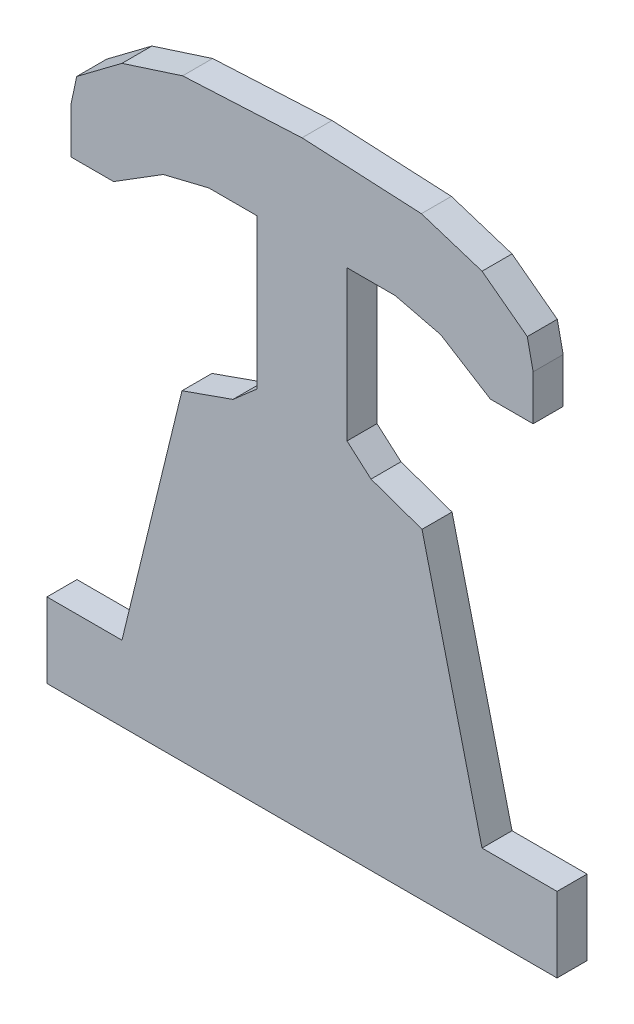
ISO-10303-21;
HEADER;
FILE_DESCRIPTION(('STEP AP214'),'2;1');
FILE_NAME('part.step','',(''),(''),'','','');
FILE_SCHEMA(('AUTOMOTIVE_DESIGN { 1 0 10303 214 1 1 1 1 }'));
ENDSEC;
DATA;
#1=APPLICATION_CONTEXT('core data for automotive mechanical design processes');
#2=APPLICATION_PROTOCOL_DEFINITION('international standard','automotive_design',2000,#1);
#3=PRODUCT_CONTEXT('',#1,'mechanical');
#4=PRODUCT('Part','Part','',(#3));
#5=PRODUCT_RELATED_PRODUCT_CATEGORY('part','',(#4));
#6=PRODUCT_DEFINITION_FORMATION('','',#4);
#7=PRODUCT_DEFINITION_CONTEXT('part definition',#1,'design');
#8=PRODUCT_DEFINITION('design','',#6,#7);
#9=PRODUCT_DEFINITION_SHAPE('','',#8);
#10=(LENGTH_UNIT() NAMED_UNIT(*) SI_UNIT(.MILLI.,.METRE.));
#11=(NAMED_UNIT(*) PLANE_ANGLE_UNIT() SI_UNIT($,.RADIAN.));
#12=(NAMED_UNIT(*) SI_UNIT($,.STERADIAN.) SOLID_ANGLE_UNIT());
#13=UNCERTAINTY_MEASURE_WITH_UNIT(LENGTH_MEASURE(1.E-05),#10,'distance_accuracy_value','');
#14=(GEOMETRIC_REPRESENTATION_CONTEXT(3) GLOBAL_UNCERTAINTY_ASSIGNED_CONTEXT((#13)) GLOBAL_UNIT_ASSIGNED_CONTEXT((#10,
#11,#12)) REPRESENTATION_CONTEXT('',''));
#15=CARTESIAN_POINT('',(0.,0.,0.));
#16=DIRECTION('',(0.,0.,1.));
#17=DIRECTION('',(1.,0.,0.));
#18=AXIS2_PLACEMENT_3D('',#15,#16,#17);
#19=CARTESIAN_POINT('',(0.,200.,10.));
#20=DIRECTION('',(0.0502041750301428,-0.998738975313141,0.));
#21=DIRECTION('',(0.998738975313141,0.0502041750301428,0.));
#22=AXIS2_PLACEMENT_3D('',#19,#20,#21);
#23=PLANE('',#22);
#24=DIRECTION('',(-0.998738975313141,-0.0502041750301428,0.));
#25=VECTOR('',#24,1.);
#26=CARTESIAN_POINT('',(0.,200.,0.));
#27=LINE('',#26,#25);
#28=CARTESIAN_POINT('',(0.,200.,0.));
#29=VERTEX_POINT('',#28);
#30=CARTESIAN_POINT('',(-39.7870884130053,198.,0.));
#31=VERTEX_POINT('',#30);
#32=EDGE_CURVE('E282',#29,#31,#27,.T.);
#33=ORIENTED_EDGE('',*,*,#32,.T.);
#34=DIRECTION('',(0.,0.,-1.));
#35=VECTOR('',#34,1.);
#36=CARTESIAN_POINT('',(-39.7870884130053,198.,10.));
#37=LINE('',#36,#35);
#38=CARTESIAN_POINT('',(-39.7870884130053,198.,10.));
#39=VERTEX_POINT('',#38);
#40=EDGE_CURVE('E11',#39,#31,#37,.T.);
#41=ORIENTED_EDGE('',*,*,#40,.F.);
#42=DIRECTION('',(-0.998738975313141,-0.0502041750301428,0.));
#43=VECTOR('',#42,1.);
#44=CARTESIAN_POINT('',(0.,200.,10.));
#45=LINE('',#44,#43);
#46=CARTESIAN_POINT('',(0.,200.,10.));
#47=VERTEX_POINT('',#46);
#48=EDGE_CURVE('E373',#47,#39,#45,.T.);
#49=ORIENTED_EDGE('',*,*,#48,.F.);
#50=DIRECTION('',(0.,0.,-1.));
#51=VECTOR('',#50,1.);
#52=CARTESIAN_POINT('',(0.,200.,10.));
#53=LINE('',#52,#51);
#54=EDGE_CURVE('E278',#47,#29,#53,.T.);
#55=ORIENTED_EDGE('',*,*,#54,.T.);
#56=EDGE_LOOP('',(#33,#41,#49,#55));
#57=FACE_BOUND('',#56,.T.);
#58=ADVANCED_FACE('F43',(#57),#23,.F.);
#59=CARTESIAN_POINT('',(-39.7870884130053,198.,10.));
#60=DIRECTION('',(0.306136929188108,-0.951987489722042,0.));
#61=DIRECTION('',(0.951987489722042,0.306136929188108,0.));
#62=AXIS2_PLACEMENT_3D('',#59,#60,#61);
#63=PLANE('',#62);
#64=DIRECTION('',(-0.951987489722042,-0.306136929188108,0.));
#65=VECTOR('',#64,1.);
#66=CARTESIAN_POINT('',(-39.7870884130053,198.,0.));
#67=LINE('',#66,#65);
#68=CARTESIAN_POINT('',(-60.,191.5,0.));
#69=VERTEX_POINT('',#68);
#70=EDGE_CURVE('E286',#31,#69,#67,.T.);
#71=ORIENTED_EDGE('',*,*,#70,.T.);
#72=DIRECTION('',(0.,0.,-1.));
#73=VECTOR('',#72,1.);
#74=CARTESIAN_POINT('',(-60.,191.5,10.));
#75=LINE('',#74,#73);
#76=CARTESIAN_POINT('',(-60.,191.5,10.));
#77=VERTEX_POINT('',#76);
#78=EDGE_CURVE('E52',#77,#69,#75,.T.);
#79=ORIENTED_EDGE('',*,*,#78,.F.);
#80=DIRECTION('',(-0.951987489722042,-0.306136929188108,0.));
#81=VECTOR('',#80,1.);
#82=CARTESIAN_POINT('',(-39.7870884130053,198.,10.));
#83=LINE('',#82,#81);
#84=EDGE_CURVE('E172',#39,#77,#83,.T.);
#85=ORIENTED_EDGE('',*,*,#84,.F.);
#86=ORIENTED_EDGE('',*,*,#40,.T.);
#87=EDGE_LOOP('',(#71,#79,#85,#86));
#88=FACE_BOUND('',#87,.T.);
#89=ADVANCED_FACE('F600',(#88),#63,.F.);
#90=CARTESIAN_POINT('',(-60.,191.5,10.));
#91=DIRECTION('',(0.600493198028697,-0.7996298638253,0.));
#92=DIRECTION('',(0.7996298638253,0.600493198028697,0.));
#93=AXIS2_PLACEMENT_3D('',#90,#91,#92);
#94=PLANE('',#93);
#95=DIRECTION('',(-0.7996298638253,-0.600493198028697,0.));
#96=VECTOR('',#95,1.);
#97=CARTESIAN_POINT('',(-60.,191.5,0.));
#98=LINE('',#97,#96);
#99=CARTESIAN_POINT('',(-75.0854249963274,180.171389714822,0.));
#100=VERTEX_POINT('',#99);
#101=EDGE_CURVE('E289',#69,#100,#98,.T.);
#102=ORIENTED_EDGE('',*,*,#101,.T.);
#103=DIRECTION('',(0.,0.,-1.));
#104=VECTOR('',#103,1.);
#105=CARTESIAN_POINT('',(-75.0854249963274,180.171389714822,10.));
#106=LINE('',#105,#104);
#107=CARTESIAN_POINT('',(-75.0854249963274,180.171389714822,10.));
#108=VERTEX_POINT('',#107);
#109=EDGE_CURVE('E476',#108,#100,#106,.T.);
#110=ORIENTED_EDGE('',*,*,#109,.F.);
#111=DIRECTION('',(-0.7996298638253,-0.600493198028697,0.));
#112=VECTOR('',#111,1.);
#113=CARTESIAN_POINT('',(-60.,191.5,10.));
#114=LINE('',#113,#112);
#115=EDGE_CURVE('E486',#77,#108,#114,.T.);
#116=ORIENTED_EDGE('',*,*,#115,.F.);
#117=ORIENTED_EDGE('',*,*,#78,.T.);
#118=EDGE_LOOP('',(#102,#110,#116,#117));
#119=FACE_BOUND('',#118,.T.);
#120=ADVANCED_FACE('F484',(#119),#94,.F.);
#121=CARTESIAN_POINT('',(-75.0854249963274,180.171389714822,10.));
#122=DIRECTION('',(0.978301757242913,-0.20718511475352,0.));
#123=DIRECTION('',(0.20718511475352,0.978301757242913,0.));
#124=AXIS2_PLACEMENT_3D('',#121,#122,#123);
#125=PLANE('',#124);
#126=DIRECTION('',(-0.20718511475352,-0.978301757242913,0.));
#127=VECTOR('',#126,1.);
#128=CARTESIAN_POINT('',(-75.0854249963274,180.171389714822,0.));
#129=LINE('',#128,#127);
#130=CARTESIAN_POINT('',(-77.0338044627042,170.971389714822,0.));
#131=VERTEX_POINT('',#130);
#132=EDGE_CURVE('E292',#100,#131,#129,.T.);
#133=ORIENTED_EDGE('',*,*,#132,.T.);
#134=DIRECTION('',(0.,0.,-1.));
#135=VECTOR('',#134,1.);
#136=CARTESIAN_POINT('',(-77.0338044627042,170.971389714822,10.));
#137=LINE('',#136,#135);
#138=CARTESIAN_POINT('',(-77.0338044627042,170.971389714822,10.));
#139=VERTEX_POINT('',#138);
#140=EDGE_CURVE('E472',#139,#131,#137,.T.);
#141=ORIENTED_EDGE('',*,*,#140,.F.);
#142=DIRECTION('',(-0.20718511475352,-0.978301757242913,0.));
#143=VECTOR('',#142,1.);
#144=CARTESIAN_POINT('',(-75.0854249963274,180.171389714822,10.));
#145=LINE('',#144,#143);
#146=EDGE_CURVE('E505',#108,#139,#145,.T.);
#147=ORIENTED_EDGE('',*,*,#146,.F.);
#148=ORIENTED_EDGE('',*,*,#109,.T.);
#149=EDGE_LOOP('',(#133,#141,#147,#148));
#150=FACE_BOUND('',#149,.T.);
#151=ADVANCED_FACE('F495',(#150),#125,.F.);
#152=CARTESIAN_POINT('',(-77.0338044627042,170.971389714822,10.));
#153=DIRECTION('',(1.,0.,0.));
#154=DIRECTION('',(0.,0.,-1.));
#155=AXIS2_PLACEMENT_3D('',#152,#153,#154);
#156=PLANE('',#155);
#157=DIRECTION('',(0.,-1.,0.));
#158=VECTOR('',#157,1.);
#159=CARTESIAN_POINT('',(-77.0338044627042,170.971389714822,0.));
#160=LINE('',#159,#158);
#161=CARTESIAN_POINT('',(-77.0338044627042,155.971389714822,0.));
#162=VERTEX_POINT('',#161);
#163=EDGE_CURVE('E295',#131,#162,#160,.T.);
#164=ORIENTED_EDGE('',*,*,#163,.T.);
#165=DIRECTION('',(0.,0.,-1.));
#166=VECTOR('',#165,1.);
#167=CARTESIAN_POINT('',(-77.0338044627042,155.971389714822,10.));
#168=LINE('',#167,#166);
#169=CARTESIAN_POINT('',(-77.0338044627042,155.971389714822,10.));
#170=VERTEX_POINT('',#169);
#171=EDGE_CURVE('E468',#170,#162,#168,.T.);
#172=ORIENTED_EDGE('',*,*,#171,.F.);
#173=DIRECTION('',(0.,-1.,0.));
#174=VECTOR('',#173,1.);
#175=CARTESIAN_POINT('',(-77.0338044627042,170.971389714822,10.));
#176=LINE('',#175,#174);
#177=EDGE_CURVE('E501',#139,#170,#176,.T.);
#178=ORIENTED_EDGE('',*,*,#177,.F.);
#179=ORIENTED_EDGE('',*,*,#140,.T.);
#180=EDGE_LOOP('',(#164,#172,#178,#179));
#181=FACE_BOUND('',#180,.T.);
#182=ADVANCED_FACE('F499',(#181),#156,.F.);
#183=CARTESIAN_POINT('',(-77.0338044627042,155.971389714822,10.));
#184=DIRECTION('',(0.,1.,0.));
#185=DIRECTION('',(0.,0.,1.));
#186=AXIS2_PLACEMENT_3D('',#183,#184,#185);
#187=PLANE('',#186);
#188=DIRECTION('',(1.,0.,0.));
#189=VECTOR('',#188,1.);
#190=CARTESIAN_POINT('',(-77.0338044627042,155.971389714822,0.));
#191=LINE('',#190,#189);
#192=CARTESIAN_POINT('',(-62.7938486432291,155.971389714822,0.));
#193=VERTEX_POINT('',#192);
#194=EDGE_CURVE('E298',#162,#193,#191,.T.);
#195=ORIENTED_EDGE('',*,*,#194,.T.);
#196=DIRECTION('',(0.,0.,-1.));
#197=VECTOR('',#196,1.);
#198=CARTESIAN_POINT('',(-62.7938486432291,155.971389714822,10.));
#199=LINE('',#198,#197);
#200=CARTESIAN_POINT('',(-62.7938486432291,155.971389714822,10.));
#201=VERTEX_POINT('',#200);
#202=EDGE_CURVE('E464',#201,#193,#199,.T.);
#203=ORIENTED_EDGE('',*,*,#202,.F.);
#204=DIRECTION('',(1.,0.,0.));
#205=VECTOR('',#204,1.);
#206=CARTESIAN_POINT('',(-77.0338044627042,155.971389714822,10.));
#207=LINE('',#206,#205);
#208=EDGE_CURVE('E504',#170,#201,#207,.T.);
#209=ORIENTED_EDGE('',*,*,#208,.F.);
#210=ORIENTED_EDGE('',*,*,#171,.T.);
#211=EDGE_LOOP('',(#195,#203,#209,#210));
#212=FACE_BOUND('',#211,.T.);
#213=ADVANCED_FACE('F613',(#212),#187,.F.);
#214=CARTESIAN_POINT('',(-46.2252698691955,166.291261255929,10.));
#215=DIRECTION('',(-0.528690857811553,0.848814453733255,0.));
#216=DIRECTION('',(-0.848814453733255,-0.528690857811553,0.));
#217=AXIS2_PLACEMENT_3D('',#214,#215,#216);
#218=PLANE('',#217);
#219=DIRECTION('',(0.848814453733255,0.528690857811553,0.));
#220=VECTOR('',#219,1.);
#221=CARTESIAN_POINT('',(-46.2252698691955,166.291261255929,0.));
#222=LINE('',#221,#220);
#223=CARTESIAN_POINT('',(-46.2252698691955,166.291261255929,0.));
#224=VERTEX_POINT('',#223);
#225=EDGE_CURVE('E301',#193,#224,#222,.T.);
#226=ORIENTED_EDGE('',*,*,#225,.T.);
#227=DIRECTION('',(0.,0.,-1.));
#228=VECTOR('',#227,1.);
#229=CARTESIAN_POINT('',(-46.2252698691955,166.291261255929,10.));
#230=LINE('',#229,#228);
#231=CARTESIAN_POINT('',(-46.2252698691955,166.291261255929,10.));
#232=VERTEX_POINT('',#231);
#233=EDGE_CURVE('E460',#232,#224,#230,.T.);
#234=ORIENTED_EDGE('',*,*,#233,.F.);
#235=DIRECTION('',(0.848814453733255,0.528690857811553,0.));
#236=VECTOR('',#235,1.);
#237=CARTESIAN_POINT('',(-46.2252698691955,166.291261255929,10.));
#238=LINE('',#237,#236);
#239=EDGE_CURVE('E509',#201,#232,#238,.T.);
#240=ORIENTED_EDGE('',*,*,#239,.F.);
#241=ORIENTED_EDGE('',*,*,#202,.T.);
#242=EDGE_LOOP('',(#226,#234,#240,#241));
#243=FACE_BOUND('',#242,.T.);
#244=ADVANCED_FACE('F616',(#243),#218,.F.);
#245=CARTESIAN_POINT('',(-31.0557683465319,170.,10.));
#246=DIRECTION('',(-0.237491663978951,0.971389576606888,0.));
#247=DIRECTION('',(-0.971389576606888,-0.237491663978951,0.));
#248=AXIS2_PLACEMENT_3D('',#245,#246,#247);
#249=PLANE('',#248);
#250=DIRECTION('',(0.971389576606888,0.237491663978951,0.));
#251=VECTOR('',#250,1.);
#252=CARTESIAN_POINT('',(-31.0557683465319,170.,0.));
#253=LINE('',#252,#251);
#254=CARTESIAN_POINT('',(-31.0557683465319,170.,0.));
#255=VERTEX_POINT('',#254);
#256=EDGE_CURVE('E304',#224,#255,#253,.T.);
#257=ORIENTED_EDGE('',*,*,#256,.T.);
#258=DIRECTION('',(0.,0.,-1.));
#259=VECTOR('',#258,1.);
#260=CARTESIAN_POINT('',(-31.0557683465319,170.,10.));
#261=LINE('',#260,#259);
#262=CARTESIAN_POINT('',(-31.0557683465319,170.,10.));
#263=VERTEX_POINT('',#262);
#264=EDGE_CURVE('E456',#263,#255,#261,.T.);
#265=ORIENTED_EDGE('',*,*,#264,.F.);
#266=DIRECTION('',(0.971389576606888,0.237491663978951,0.));
#267=VECTOR('',#266,1.);
#268=CARTESIAN_POINT('',(-31.0557683465319,170.,10.));
#269=LINE('',#268,#267);
#270=EDGE_CURVE('E516',#232,#263,#269,.T.);
#271=ORIENTED_EDGE('',*,*,#270,.F.);
#272=ORIENTED_EDGE('',*,*,#233,.T.);
#273=EDGE_LOOP('',(#257,#265,#271,#272));
#274=FACE_BOUND('',#273,.T.);
#275=ADVANCED_FACE('F620',(#274),#249,.F.);
#276=CARTESIAN_POINT('',(-15.,170.,10.));
#277=DIRECTION('',(0.,1.,0.));
#278=DIRECTION('',(0.,0.,1.));
#279=AXIS2_PLACEMENT_3D('',#276,#277,#278);
#280=PLANE('',#279);
#281=DIRECTION('',(1.,0.,0.));
#282=VECTOR('',#281,1.);
#283=CARTESIAN_POINT('',(-15.,170.,0.));
#284=LINE('',#283,#282);
#285=CARTESIAN_POINT('',(-15.,170.,0.));
#286=VERTEX_POINT('',#285);
#287=EDGE_CURVE('E307',#255,#286,#284,.T.);
#288=ORIENTED_EDGE('',*,*,#287,.T.);
#289=DIRECTION('',(0.,0.,-1.));
#290=VECTOR('',#289,1.);
#291=CARTESIAN_POINT('',(-15.,170.,10.));
#292=LINE('',#291,#290);
#293=CARTESIAN_POINT('',(-15.,170.,10.));
#294=VERTEX_POINT('',#293);
#295=EDGE_CURVE('E452',#294,#286,#292,.T.);
#296=ORIENTED_EDGE('',*,*,#295,.F.);
#297=DIRECTION('',(1.,0.,0.));
#298=VECTOR('',#297,1.);
#299=CARTESIAN_POINT('',(-15.,170.,10.));
#300=LINE('',#299,#298);
#301=EDGE_CURVE('E519',#263,#294,#300,.T.);
#302=ORIENTED_EDGE('',*,*,#301,.F.);
#303=ORIENTED_EDGE('',*,*,#264,.T.);
#304=EDGE_LOOP('',(#288,#296,#302,#303));
#305=FACE_BOUND('',#304,.T.);
#306=ADVANCED_FACE('F624',(#305),#280,.F.);
#307=CARTESIAN_POINT('',(-15.,120.,10.));
#308=DIRECTION('',(1.,0.,0.));
#309=DIRECTION('',(0.,1.,0.));
#310=AXIS2_PLACEMENT_3D('',#307,#308,#309);
#311=PLANE('',#310);
#312=DIRECTION('',(0.,-1.,0.));
#313=VECTOR('',#312,1.);
#314=CARTESIAN_POINT('',(-15.,120.,0.));
#315=LINE('',#314,#313);
#316=CARTESIAN_POINT('',(-15.,120.,0.));
#317=VERTEX_POINT('',#316);
#318=EDGE_CURVE('E310',#286,#317,#315,.T.);
#319=ORIENTED_EDGE('',*,*,#318,.T.);
#320=DIRECTION('',(0.,0.,-1.));
#321=VECTOR('',#320,1.);
#322=CARTESIAN_POINT('',(-15.,120.,10.));
#323=LINE('',#322,#321);
#324=CARTESIAN_POINT('',(-15.,120.,10.));
#325=VERTEX_POINT('',#324);
#326=EDGE_CURVE('E448',#325,#317,#323,.T.);
#327=ORIENTED_EDGE('',*,*,#326,.F.);
#328=DIRECTION('',(0.,-1.,0.));
#329=VECTOR('',#328,1.);
#330=CARTESIAN_POINT('',(-15.,120.,10.));
#331=LINE('',#330,#329);
#332=EDGE_CURVE('E522',#294,#325,#331,.T.);
#333=ORIENTED_EDGE('',*,*,#332,.F.);
#334=ORIENTED_EDGE('',*,*,#295,.T.);
#335=EDGE_LOOP('',(#319,#327,#333,#334));
#336=FACE_BOUND('',#335,.T.);
#337=ADVANCED_FACE('F628',(#336),#311,.F.);
#338=CARTESIAN_POINT('',(-23.,113.,10.));
#339=DIRECTION('',(0.658504607868519,-0.752576694706877,0.));
#340=DIRECTION('',(0.752576694706877,0.658504607868519,0.));
#341=AXIS2_PLACEMENT_3D('',#338,#339,#340);
#342=PLANE('',#341);
#343=DIRECTION('',(-0.752576694706877,-0.658504607868519,0.));
#344=VECTOR('',#343,1.);
#345=CARTESIAN_POINT('',(-23.,113.,0.));
#346=LINE('',#345,#344);
#347=CARTESIAN_POINT('',(-23.,113.,0.));
#348=VERTEX_POINT('',#347);
#349=EDGE_CURVE('E313',#317,#348,#346,.T.);
#350=ORIENTED_EDGE('',*,*,#349,.T.);
#351=DIRECTION('',(0.,0.,-1.));
#352=VECTOR('',#351,1.);
#353=CARTESIAN_POINT('',(-23.,113.,10.));
#354=LINE('',#353,#352);
#355=CARTESIAN_POINT('',(-23.,113.,10.));
#356=VERTEX_POINT('',#355);
#357=EDGE_CURVE('E444',#356,#348,#354,.T.);
#358=ORIENTED_EDGE('',*,*,#357,.F.);
#359=DIRECTION('',(-0.752576694706877,-0.658504607868519,0.));
#360=VECTOR('',#359,1.);
#361=CARTESIAN_POINT('',(-23.,113.,10.));
#362=LINE('',#361,#360);
#363=EDGE_CURVE('E525',#325,#356,#362,.T.);
#364=ORIENTED_EDGE('',*,*,#363,.F.);
#365=ORIENTED_EDGE('',*,*,#326,.T.);
#366=EDGE_LOOP('',(#350,#358,#364,#365));
#367=FACE_BOUND('',#366,.T.);
#368=ADVANCED_FACE('F632',(#367),#342,.F.);
#369=CARTESIAN_POINT('',(-40.,107.,10.));
#370=DIRECTION('',(0.332820117735137,-0.94299033358289,0.));
#371=DIRECTION('',(0.94299033358289,0.332820117735137,0.));
#372=AXIS2_PLACEMENT_3D('',#369,#370,#371);
#373=PLANE('',#372);
#374=DIRECTION('',(-0.94299033358289,-0.332820117735137,0.));
#375=VECTOR('',#374,1.);
#376=CARTESIAN_POINT('',(-40.,107.,0.));
#377=LINE('',#376,#375);
#378=CARTESIAN_POINT('',(-40.,107.,0.));
#379=VERTEX_POINT('',#378);
#380=EDGE_CURVE('E316',#348,#379,#377,.T.);
#381=ORIENTED_EDGE('',*,*,#380,.T.);
#382=DIRECTION('',(0.,0.,-1.));
#383=VECTOR('',#382,1.);
#384=CARTESIAN_POINT('',(-40.,107.,10.));
#385=LINE('',#384,#383);
#386=CARTESIAN_POINT('',(-40.,107.,10.));
#387=VERTEX_POINT('',#386);
#388=EDGE_CURVE('E440',#387,#379,#385,.T.);
#389=ORIENTED_EDGE('',*,*,#388,.F.);
#390=DIRECTION('',(-0.94299033358289,-0.332820117735137,0.));
#391=VECTOR('',#390,1.);
#392=CARTESIAN_POINT('',(-40.,107.,10.));
#393=LINE('',#392,#391);
#394=EDGE_CURVE('E528',#356,#387,#393,.T.);
#395=ORIENTED_EDGE('',*,*,#394,.F.);
#396=ORIENTED_EDGE('',*,*,#357,.T.);
#397=EDGE_LOOP('',(#381,#389,#395,#396));
#398=FACE_BOUND('',#397,.T.);
#399=ADVANCED_FACE('F636',(#398),#373,.F.);
#400=CARTESIAN_POINT('',(-60.,25.,10.));
#401=DIRECTION('',(0.97152033878313,-0.236956180191007,0.));
#402=DIRECTION('',(0.236956180191007,0.97152033878313,0.));
#403=AXIS2_PLACEMENT_3D('',#400,#401,#402);
#404=PLANE('',#403);
#405=DIRECTION('',(-0.236956180191007,-0.97152033878313,0.));
#406=VECTOR('',#405,1.);
#407=CARTESIAN_POINT('',(-60.,25.,0.));
#408=LINE('',#407,#406);
#409=CARTESIAN_POINT('',(-60.,25.,0.));
#410=VERTEX_POINT('',#409);
#411=EDGE_CURVE('E319',#379,#410,#408,.T.);
#412=ORIENTED_EDGE('',*,*,#411,.T.);
#413=DIRECTION('',(0.,0.,-1.));
#414=VECTOR('',#413,1.);
#415=CARTESIAN_POINT('',(-60.,25.,10.));
#416=LINE('',#415,#414);
#417=CARTESIAN_POINT('',(-60.,25.,10.));
#418=VERTEX_POINT('',#417);
#419=EDGE_CURVE('E436',#418,#410,#416,.T.);
#420=ORIENTED_EDGE('',*,*,#419,.F.);
#421=DIRECTION('',(-0.236956180191007,-0.97152033878313,0.));
#422=VECTOR('',#421,1.);
#423=CARTESIAN_POINT('',(-60.,25.,10.));
#424=LINE('',#423,#422);
#425=EDGE_CURVE('E531',#387,#418,#424,.T.);
#426=ORIENTED_EDGE('',*,*,#425,.F.);
#427=ORIENTED_EDGE('',*,*,#388,.T.);
#428=EDGE_LOOP('',(#412,#420,#426,#427));
#429=FACE_BOUND('',#428,.T.);
#430=ADVANCED_FACE('F640',(#429),#404,.F.);
#431=CARTESIAN_POINT('',(-85.,25.,10.));
#432=DIRECTION('',(0.,-1.,0.));
#433=DIRECTION('',(0.,0.,-1.));
#434=AXIS2_PLACEMENT_3D('',#431,#432,#433);
#435=PLANE('',#434);
#436=DIRECTION('',(-1.,0.,0.));
#437=VECTOR('',#436,1.);
#438=CARTESIAN_POINT('',(-85.,25.,0.));
#439=LINE('',#438,#437);
#440=CARTESIAN_POINT('',(-85.,25.,0.));
#441=VERTEX_POINT('',#440);
#442=EDGE_CURVE('E322',#410,#441,#439,.T.);
#443=ORIENTED_EDGE('',*,*,#442,.T.);
#444=DIRECTION('',(0.,0.,-1.));
#445=VECTOR('',#444,1.);
#446=CARTESIAN_POINT('',(-85.,25.,10.));
#447=LINE('',#446,#445);
#448=CARTESIAN_POINT('',(-85.,25.,10.));
#449=VERTEX_POINT('',#448);
#450=EDGE_CURVE('E432',#449,#441,#447,.T.);
#451=ORIENTED_EDGE('',*,*,#450,.F.);
#452=DIRECTION('',(-1.,0.,0.));
#453=VECTOR('',#452,1.);
#454=CARTESIAN_POINT('',(-85.,25.,10.));
#455=LINE('',#454,#453);
#456=EDGE_CURVE('E534',#418,#449,#455,.T.);
#457=ORIENTED_EDGE('',*,*,#456,.F.);
#458=ORIENTED_EDGE('',*,*,#419,.T.);
#459=EDGE_LOOP('',(#443,#451,#457,#458));
#460=FACE_BOUND('',#459,.T.);
#461=ADVANCED_FACE('F644',(#460),#435,.F.);
#462=CARTESIAN_POINT('',(-85.,0.,10.));
#463=DIRECTION('',(1.,0.,0.));
#464=DIRECTION('',(0.,1.,0.));
#465=AXIS2_PLACEMENT_3D('',#462,#463,#464);
#466=PLANE('',#465);
#467=DIRECTION('',(0.,-1.,0.));
#468=VECTOR('',#467,1.);
#469=CARTESIAN_POINT('',(-85.,0.,0.));
#470=LINE('',#469,#468);
#471=CARTESIAN_POINT('',(-85.,0.,0.));
#472=VERTEX_POINT('',#471);
#473=EDGE_CURVE('E325',#441,#472,#470,.T.);
#474=ORIENTED_EDGE('',*,*,#473,.T.);
#475=DIRECTION('',(0.,0.,-1.));
#476=VECTOR('',#475,1.);
#477=CARTESIAN_POINT('',(-85.,0.,10.));
#478=LINE('',#477,#476);
#479=CARTESIAN_POINT('',(-85.,0.,10.));
#480=VERTEX_POINT('',#479);
#481=EDGE_CURVE('E428',#480,#472,#478,.T.);
#482=ORIENTED_EDGE('',*,*,#481,.F.);
#483=DIRECTION('',(0.,-1.,0.));
#484=VECTOR('',#483,1.);
#485=CARTESIAN_POINT('',(-85.,0.,10.));
#486=LINE('',#485,#484);
#487=EDGE_CURVE('E537',#449,#480,#486,.T.);
#488=ORIENTED_EDGE('',*,*,#487,.F.);
#489=ORIENTED_EDGE('',*,*,#450,.T.);
#490=EDGE_LOOP('',(#474,#482,#488,#489));
#491=FACE_BOUND('',#490,.T.);
#492=ADVANCED_FACE('F648',(#491),#466,.F.);
#493=CARTESIAN_POINT('',(-85.,0.,10.));
#494=DIRECTION('',(0.,1.,0.));
#495=DIRECTION('',(0.,0.,1.));
#496=AXIS2_PLACEMENT_3D('',#493,#494,#495);
#497=PLANE('',#496);
#498=DIRECTION('',(1.,0.,0.));
#499=VECTOR('',#498,1.);
#500=CARTESIAN_POINT('',(-85.,0.,0.));
#501=LINE('',#500,#499);
#502=CARTESIAN_POINT('',(85.,0.,0.));
#503=VERTEX_POINT('',#502);
#504=EDGE_CURVE('E328',#472,#503,#501,.T.);
#505=ORIENTED_EDGE('',*,*,#504,.T.);
#506=DIRECTION('',(0.,0.,-1.));
#507=VECTOR('',#506,1.);
#508=CARTESIAN_POINT('',(85.,0.,10.));
#509=LINE('',#508,#507);
#510=CARTESIAN_POINT('',(85.,0.,10.));
#511=VERTEX_POINT('',#510);
#512=EDGE_CURVE('E424',#511,#503,#509,.T.);
#513=ORIENTED_EDGE('',*,*,#512,.F.);
#514=DIRECTION('',(1.,0.,0.));
#515=VECTOR('',#514,1.);
#516=CARTESIAN_POINT('',(-85.,0.,10.));
#517=LINE('',#516,#515);
#518=EDGE_CURVE('E540',#480,#511,#517,.T.);
#519=ORIENTED_EDGE('',*,*,#518,.F.);
#520=ORIENTED_EDGE('',*,*,#481,.T.);
#521=EDGE_LOOP('',(#505,#513,#519,#520));
#522=FACE_BOUND('',#521,.T.);
#523=ADVANCED_FACE('F652',(#522),#497,.F.);
#524=CARTESIAN_POINT('',(85.,0.,10.));
#525=DIRECTION('',(-1.,0.,0.));
#526=DIRECTION('',(0.,-1.,0.));
#527=AXIS2_PLACEMENT_3D('',#524,#525,#526);
#528=PLANE('',#527);
#529=DIRECTION('',(0.,1.,0.));
#530=VECTOR('',#529,1.);
#531=CARTESIAN_POINT('',(85.,0.,0.));
#532=LINE('',#531,#530);
#533=CARTESIAN_POINT('',(85.,25.,0.));
#534=VERTEX_POINT('',#533);
#535=EDGE_CURVE('E331',#503,#534,#532,.T.);
#536=ORIENTED_EDGE('',*,*,#535,.T.);
#537=DIRECTION('',(0.,0.,-1.));
#538=VECTOR('',#537,1.);
#539=CARTESIAN_POINT('',(85.,25.,10.));
#540=LINE('',#539,#538);
#541=CARTESIAN_POINT('',(85.,25.,10.));
#542=VERTEX_POINT('',#541);
#543=EDGE_CURVE('E420',#542,#534,#540,.T.);
#544=ORIENTED_EDGE('',*,*,#543,.F.);
#545=DIRECTION('',(0.,1.,0.));
#546=VECTOR('',#545,1.);
#547=CARTESIAN_POINT('',(85.,0.,10.));
#548=LINE('',#547,#546);
#549=EDGE_CURVE('E543',#511,#542,#548,.T.);
#550=ORIENTED_EDGE('',*,*,#549,.F.);
#551=ORIENTED_EDGE('',*,*,#512,.T.);
#552=EDGE_LOOP('',(#536,#544,#550,#551));
#553=FACE_BOUND('',#552,.T.);
#554=ADVANCED_FACE('F656',(#553),#528,.F.);
#555=CARTESIAN_POINT('',(85.,25.,10.));
#556=DIRECTION('',(0.,-1.,0.));
#557=DIRECTION('',(0.,0.,-1.));
#558=AXIS2_PLACEMENT_3D('',#555,#556,#557);
#559=PLANE('',#558);
#560=DIRECTION('',(-1.,0.,0.));
#561=VECTOR('',#560,1.);
#562=CARTESIAN_POINT('',(85.,25.,0.));
#563=LINE('',#562,#561);
#564=CARTESIAN_POINT('',(60.,25.,0.));
#565=VERTEX_POINT('',#564);
#566=EDGE_CURVE('E334',#534,#565,#563,.T.);
#567=ORIENTED_EDGE('',*,*,#566,.T.);
#568=DIRECTION('',(0.,0.,-1.));
#569=VECTOR('',#568,1.);
#570=CARTESIAN_POINT('',(60.,25.,10.));
#571=LINE('',#570,#569);
#572=CARTESIAN_POINT('',(60.,25.,10.));
#573=VERTEX_POINT('',#572);
#574=EDGE_CURVE('E416',#573,#565,#571,.T.);
#575=ORIENTED_EDGE('',*,*,#574,.F.);
#576=DIRECTION('',(-1.,0.,0.));
#577=VECTOR('',#576,1.);
#578=CARTESIAN_POINT('',(85.,25.,10.));
#579=LINE('',#578,#577);
#580=EDGE_CURVE('E546',#542,#573,#579,.T.);
#581=ORIENTED_EDGE('',*,*,#580,.F.);
#582=ORIENTED_EDGE('',*,*,#543,.T.);
#583=EDGE_LOOP('',(#567,#575,#581,#582));
#584=FACE_BOUND('',#583,.T.);
#585=ADVANCED_FACE('F660',(#584),#559,.F.);
#586=CARTESIAN_POINT('',(60.,25.,10.));
#587=DIRECTION('',(-0.97152033878313,-0.236956180191007,0.));
#588=DIRECTION('',(0.236956180191007,-0.97152033878313,0.));
#589=AXIS2_PLACEMENT_3D('',#586,#587,#588);
#590=PLANE('',#589);
#591=DIRECTION('',(-0.236956180191007,0.97152033878313,0.));
#592=VECTOR('',#591,1.);
#593=CARTESIAN_POINT('',(60.,25.,0.));
#594=LINE('',#593,#592);
#595=CARTESIAN_POINT('',(40.,107.,0.));
#596=VERTEX_POINT('',#595);
#597=EDGE_CURVE('E337',#565,#596,#594,.T.);
#598=ORIENTED_EDGE('',*,*,#597,.T.);
#599=DIRECTION('',(0.,0.,-1.));
#600=VECTOR('',#599,1.);
#601=CARTESIAN_POINT('',(40.,107.,10.));
#602=LINE('',#601,#600);
#603=CARTESIAN_POINT('',(40.,107.,10.));
#604=VERTEX_POINT('',#603);
#605=EDGE_CURVE('E412',#604,#596,#602,.T.);
#606=ORIENTED_EDGE('',*,*,#605,.F.);
#607=DIRECTION('',(-0.236956180191007,0.97152033878313,0.));
#608=VECTOR('',#607,1.);
#609=CARTESIAN_POINT('',(60.,25.,10.));
#610=LINE('',#609,#608);
#611=EDGE_CURVE('E549',#573,#604,#610,.T.);
#612=ORIENTED_EDGE('',*,*,#611,.F.);
#613=ORIENTED_EDGE('',*,*,#574,.T.);
#614=EDGE_LOOP('',(#598,#606,#612,#613));
#615=FACE_BOUND('',#614,.T.);
#616=ADVANCED_FACE('F664',(#615),#590,.F.);
#617=CARTESIAN_POINT('',(40.,107.,10.));
#618=DIRECTION('',(-0.332820117735137,-0.94299033358289,0.));
#619=DIRECTION('',(0.94299033358289,-0.332820117735137,0.));
#620=AXIS2_PLACEMENT_3D('',#617,#618,#619);
#621=PLANE('',#620);
#622=DIRECTION('',(-0.94299033358289,0.332820117735137,0.));
#623=VECTOR('',#622,1.);
#624=CARTESIAN_POINT('',(40.,107.,0.));
#625=LINE('',#624,#623);
#626=CARTESIAN_POINT('',(23.,113.,0.));
#627=VERTEX_POINT('',#626);
#628=EDGE_CURVE('E340',#596,#627,#625,.T.);
#629=ORIENTED_EDGE('',*,*,#628,.T.);
#630=DIRECTION('',(0.,0.,-1.));
#631=VECTOR('',#630,1.);
#632=CARTESIAN_POINT('',(23.,113.,10.));
#633=LINE('',#632,#631);
#634=CARTESIAN_POINT('',(23.,113.,10.));
#635=VERTEX_POINT('',#634);
#636=EDGE_CURVE('E408',#635,#627,#633,.T.);
#637=ORIENTED_EDGE('',*,*,#636,.F.);
#638=DIRECTION('',(-0.94299033358289,0.332820117735137,0.));
#639=VECTOR('',#638,1.);
#640=CARTESIAN_POINT('',(40.,107.,10.));
#641=LINE('',#640,#639);
#642=EDGE_CURVE('E552',#604,#635,#641,.T.);
#643=ORIENTED_EDGE('',*,*,#642,.F.);
#644=ORIENTED_EDGE('',*,*,#605,.T.);
#645=EDGE_LOOP('',(#629,#637,#643,#644));
#646=FACE_BOUND('',#645,.T.);
#647=ADVANCED_FACE('F668',(#646),#621,.F.);
#648=CARTESIAN_POINT('',(23.,113.,10.));
#649=DIRECTION('',(-0.658504607868519,-0.752576694706877,0.));
#650=DIRECTION('',(0.752576694706877,-0.658504607868519,0.));
#651=AXIS2_PLACEMENT_3D('',#648,#649,#650);
#652=PLANE('',#651);
#653=DIRECTION('',(-0.752576694706877,0.658504607868519,0.));
#654=VECTOR('',#653,1.);
#655=CARTESIAN_POINT('',(23.,113.,0.));
#656=LINE('',#655,#654);
#657=CARTESIAN_POINT('',(15.,120.,0.));
#658=VERTEX_POINT('',#657);
#659=EDGE_CURVE('E343',#627,#658,#656,.T.);
#660=ORIENTED_EDGE('',*,*,#659,.T.);
#661=DIRECTION('',(0.,0.,-1.));
#662=VECTOR('',#661,1.);
#663=CARTESIAN_POINT('',(15.,120.,10.));
#664=LINE('',#663,#662);
#665=CARTESIAN_POINT('',(15.,120.,10.));
#666=VERTEX_POINT('',#665);
#667=EDGE_CURVE('E404',#666,#658,#664,.T.);
#668=ORIENTED_EDGE('',*,*,#667,.F.);
#669=DIRECTION('',(-0.752576694706877,0.658504607868519,0.));
#670=VECTOR('',#669,1.);
#671=CARTESIAN_POINT('',(23.,113.,10.));
#672=LINE('',#671,#670);
#673=EDGE_CURVE('E555',#635,#666,#672,.T.);
#674=ORIENTED_EDGE('',*,*,#673,.F.);
#675=ORIENTED_EDGE('',*,*,#636,.T.);
#676=EDGE_LOOP('',(#660,#668,#674,#675));
#677=FACE_BOUND('',#676,.T.);
#678=ADVANCED_FACE('F672',(#677),#652,.F.);
#679=CARTESIAN_POINT('',(15.,120.,10.));
#680=DIRECTION('',(-1.,0.,0.));
#681=DIRECTION('',(0.,-1.,0.));
#682=AXIS2_PLACEMENT_3D('',#679,#680,#681);
#683=PLANE('',#682);
#684=DIRECTION('',(0.,1.,0.));
#685=VECTOR('',#684,1.);
#686=CARTESIAN_POINT('',(15.,120.,0.));
#687=LINE('',#686,#685);
#688=CARTESIAN_POINT('',(15.,170.,0.));
#689=VERTEX_POINT('',#688);
#690=EDGE_CURVE('E346',#658,#689,#687,.T.);
#691=ORIENTED_EDGE('',*,*,#690,.T.);
#692=DIRECTION('',(0.,0.,-1.));
#693=VECTOR('',#692,1.);
#694=CARTESIAN_POINT('',(15.,170.,10.));
#695=LINE('',#694,#693);
#696=CARTESIAN_POINT('',(15.,170.,10.));
#697=VERTEX_POINT('',#696);
#698=EDGE_CURVE('E400',#697,#689,#695,.T.);
#699=ORIENTED_EDGE('',*,*,#698,.F.);
#700=DIRECTION('',(0.,1.,0.));
#701=VECTOR('',#700,1.);
#702=CARTESIAN_POINT('',(15.,120.,10.));
#703=LINE('',#702,#701);
#704=EDGE_CURVE('E558',#666,#697,#703,.T.);
#705=ORIENTED_EDGE('',*,*,#704,.F.);
#706=ORIENTED_EDGE('',*,*,#667,.T.);
#707=EDGE_LOOP('',(#691,#699,#705,#706));
#708=FACE_BOUND('',#707,.T.);
#709=ADVANCED_FACE('F676',(#708),#683,.F.);
#710=CARTESIAN_POINT('',(15.,170.,10.));
#711=DIRECTION('',(0.,1.,0.));
#712=DIRECTION('',(0.,0.,1.));
#713=AXIS2_PLACEMENT_3D('',#710,#711,#712);
#714=PLANE('',#713);
#715=DIRECTION('',(1.,0.,0.));
#716=VECTOR('',#715,1.);
#717=CARTESIAN_POINT('',(15.,170.,0.));
#718=LINE('',#717,#716);
#719=CARTESIAN_POINT('',(31.0557683465319,170.,0.));
#720=VERTEX_POINT('',#719);
#721=EDGE_CURVE('E349',#689,#720,#718,.T.);
#722=ORIENTED_EDGE('',*,*,#721,.T.);
#723=DIRECTION('',(0.,0.,-1.));
#724=VECTOR('',#723,1.);
#725=CARTESIAN_POINT('',(31.0557683465319,170.,10.));
#726=LINE('',#725,#724);
#727=CARTESIAN_POINT('',(31.0557683465319,170.,10.));
#728=VERTEX_POINT('',#727);
#729=EDGE_CURVE('E396',#728,#720,#726,.T.);
#730=ORIENTED_EDGE('',*,*,#729,.F.);
#731=DIRECTION('',(1.,0.,0.));
#732=VECTOR('',#731,1.);
#733=CARTESIAN_POINT('',(15.,170.,10.));
#734=LINE('',#733,#732);
#735=EDGE_CURVE('E561',#697,#728,#734,.T.);
#736=ORIENTED_EDGE('',*,*,#735,.F.);
#737=ORIENTED_EDGE('',*,*,#698,.T.);
#738=EDGE_LOOP('',(#722,#730,#736,#737));
#739=FACE_BOUND('',#738,.T.);
#740=ADVANCED_FACE('F680',(#739),#714,.F.);
#741=CARTESIAN_POINT('',(31.0557683465319,170.,10.));
#742=DIRECTION('',(0.237491663978951,0.971389576606888,0.));
#743=DIRECTION('',(-0.971389576606888,0.237491663978951,0.));
#744=AXIS2_PLACEMENT_3D('',#741,#742,#743);
#745=PLANE('',#744);
#746=DIRECTION('',(0.971389576606888,-0.237491663978951,0.));
#747=VECTOR('',#746,1.);
#748=CARTESIAN_POINT('',(31.0557683465319,170.,0.));
#749=LINE('',#748,#747);
#750=CARTESIAN_POINT('',(46.2252698691955,166.291261255929,0.));
#751=VERTEX_POINT('',#750);
#752=EDGE_CURVE('E352',#720,#751,#749,.T.);
#753=ORIENTED_EDGE('',*,*,#752,.T.);
#754=DIRECTION('',(0.,0.,-1.));
#755=VECTOR('',#754,1.);
#756=CARTESIAN_POINT('',(46.2252698691955,166.291261255929,10.));
#757=LINE('',#756,#755);
#758=CARTESIAN_POINT('',(46.2252698691955,166.291261255929,10.));
#759=VERTEX_POINT('',#758);
#760=EDGE_CURVE('E392',#759,#751,#757,.T.);
#761=ORIENTED_EDGE('',*,*,#760,.F.);
#762=DIRECTION('',(0.971389576606888,-0.237491663978951,0.));
#763=VECTOR('',#762,1.);
#764=CARTESIAN_POINT('',(31.0557683465319,170.,10.));
#765=LINE('',#764,#763);
#766=EDGE_CURVE('E564',#728,#759,#765,.T.);
#767=ORIENTED_EDGE('',*,*,#766,.F.);
#768=ORIENTED_EDGE('',*,*,#729,.T.);
#769=EDGE_LOOP('',(#753,#761,#767,#768));
#770=FACE_BOUND('',#769,.T.);
#771=ADVANCED_FACE('F684',(#770),#745,.F.);
#772=CARTESIAN_POINT('',(46.2252698691955,166.291261255929,10.));
#773=DIRECTION('',(0.528690857811553,0.848814453733255,0.));
#774=DIRECTION('',(-0.848814453733255,0.528690857811553,0.));
#775=AXIS2_PLACEMENT_3D('',#772,#773,#774);
#776=PLANE('',#775);
#777=DIRECTION('',(0.848814453733255,-0.528690857811553,0.));
#778=VECTOR('',#777,1.);
#779=CARTESIAN_POINT('',(46.2252698691955,166.291261255929,0.));
#780=LINE('',#779,#778);
#781=CARTESIAN_POINT('',(62.7938486432291,155.971389714822,0.));
#782=VERTEX_POINT('',#781);
#783=EDGE_CURVE('E355',#751,#782,#780,.T.);
#784=ORIENTED_EDGE('',*,*,#783,.T.);
#785=DIRECTION('',(0.,0.,-1.));
#786=VECTOR('',#785,1.);
#787=CARTESIAN_POINT('',(62.7938486432291,155.971389714822,10.));
#788=LINE('',#787,#786);
#789=CARTESIAN_POINT('',(62.7938486432291,155.971389714822,10.));
#790=VERTEX_POINT('',#789);
#791=EDGE_CURVE('E388',#790,#782,#788,.T.);
#792=ORIENTED_EDGE('',*,*,#791,.F.);
#793=DIRECTION('',(0.848814453733255,-0.528690857811553,0.));
#794=VECTOR('',#793,1.);
#795=CARTESIAN_POINT('',(46.2252698691955,166.291261255929,10.));
#796=LINE('',#795,#794);
#797=EDGE_CURVE('E567',#759,#790,#796,.T.);
#798=ORIENTED_EDGE('',*,*,#797,.F.);
#799=ORIENTED_EDGE('',*,*,#760,.T.);
#800=EDGE_LOOP('',(#784,#792,#798,#799));
#801=FACE_BOUND('',#800,.T.);
#802=ADVANCED_FACE('F688',(#801),#776,.F.);
#803=CARTESIAN_POINT('',(77.0338044627042,155.971389714822,10.));
#804=DIRECTION('',(0.,1.,0.));
#805=DIRECTION('',(0.,0.,1.));
#806=AXIS2_PLACEMENT_3D('',#803,#804,#805);
#807=PLANE('',#806);
#808=DIRECTION('',(1.,0.,0.));
#809=VECTOR('',#808,1.);
#810=CARTESIAN_POINT('',(77.0338044627042,155.971389714822,0.));
#811=LINE('',#810,#809);
#812=CARTESIAN_POINT('',(77.0338044627042,155.971389714822,0.));
#813=VERTEX_POINT('',#812);
#814=EDGE_CURVE('E358',#782,#813,#811,.T.);
#815=ORIENTED_EDGE('',*,*,#814,.T.);
#816=DIRECTION('',(0.,0.,-1.));
#817=VECTOR('',#816,1.);
#818=CARTESIAN_POINT('',(77.0338044627042,155.971389714822,10.));
#819=LINE('',#818,#817);
#820=CARTESIAN_POINT('',(77.0338044627042,155.971389714822,10.));
#821=VERTEX_POINT('',#820);
#822=EDGE_CURVE('E384',#821,#813,#819,.T.);
#823=ORIENTED_EDGE('',*,*,#822,.F.);
#824=DIRECTION('',(1.,0.,0.));
#825=VECTOR('',#824,1.);
#826=CARTESIAN_POINT('',(77.0338044627042,155.971389714822,10.));
#827=LINE('',#826,#825);
#828=EDGE_CURVE('E570',#790,#821,#827,.T.);
#829=ORIENTED_EDGE('',*,*,#828,.F.);
#830=ORIENTED_EDGE('',*,*,#791,.T.);
#831=EDGE_LOOP('',(#815,#823,#829,#830));
#832=FACE_BOUND('',#831,.T.);
#833=ADVANCED_FACE('F692',(#832),#807,.F.);
#834=CARTESIAN_POINT('',(77.0338044627042,170.971389714822,10.));
#835=DIRECTION('',(-1.,0.,0.));
#836=DIRECTION('',(0.,0.,1.));
#837=AXIS2_PLACEMENT_3D('',#834,#835,#836);
#838=PLANE('',#837);
#839=DIRECTION('',(0.,1.,0.));
#840=VECTOR('',#839,1.);
#841=CARTESIAN_POINT('',(77.0338044627042,170.971389714822,0.));
#842=LINE('',#841,#840);
#843=CARTESIAN_POINT('',(77.0338044627042,170.971389714822,0.));
#844=VERTEX_POINT('',#843);
#845=EDGE_CURVE('E361',#813,#844,#842,.T.);
#846=ORIENTED_EDGE('',*,*,#845,.T.);
#847=DIRECTION('',(0.,0.,-1.));
#848=VECTOR('',#847,1.);
#849=CARTESIAN_POINT('',(77.0338044627042,170.971389714822,10.));
#850=LINE('',#849,#848);
#851=CARTESIAN_POINT('',(77.0338044627042,170.971389714822,10.));
#852=VERTEX_POINT('',#851);
#853=EDGE_CURVE('E380',#852,#844,#850,.T.);
#854=ORIENTED_EDGE('',*,*,#853,.F.);
#855=DIRECTION('',(0.,1.,0.));
#856=VECTOR('',#855,1.);
#857=CARTESIAN_POINT('',(77.0338044627042,170.971389714822,10.));
#858=LINE('',#857,#856);
#859=EDGE_CURVE('E573',#821,#852,#858,.T.);
#860=ORIENTED_EDGE('',*,*,#859,.F.);
#861=ORIENTED_EDGE('',*,*,#822,.T.);
#862=EDGE_LOOP('',(#846,#854,#860,#861));
#863=FACE_BOUND('',#862,.T.);
#864=ADVANCED_FACE('F581',(#863),#838,.F.);
#865=CARTESIAN_POINT('',(75.0854249963274,180.171389714822,10.));
#866=DIRECTION('',(-0.978301757242913,-0.20718511475352,0.));
#867=DIRECTION('',(0.20718511475352,-0.978301757242913,0.));
#868=AXIS2_PLACEMENT_3D('',#865,#866,#867);
#869=PLANE('',#868);
#870=DIRECTION('',(-0.20718511475352,0.978301757242913,0.));
#871=VECTOR('',#870,1.);
#872=CARTESIAN_POINT('',(75.0854249963274,180.171389714822,0.));
#873=LINE('',#872,#871);
#874=CARTESIAN_POINT('',(75.0854249963274,180.171389714822,0.));
#875=VERTEX_POINT('',#874);
#876=EDGE_CURVE('E364',#844,#875,#873,.T.);
#877=ORIENTED_EDGE('',*,*,#876,.T.);
#878=DIRECTION('',(0.,0.,-1.));
#879=VECTOR('',#878,1.);
#880=CARTESIAN_POINT('',(75.0854249963274,180.171389714822,10.));
#881=LINE('',#880,#879);
#882=CARTESIAN_POINT('',(75.0854249963274,180.171389714822,10.));
#883=VERTEX_POINT('',#882);
#884=EDGE_CURVE('E271',#883,#875,#881,.T.);
#885=ORIENTED_EDGE('',*,*,#884,.F.);
#886=DIRECTION('',(-0.20718511475352,0.978301757242913,0.));
#887=VECTOR('',#886,1.);
#888=CARTESIAN_POINT('',(75.0854249963274,180.171389714822,10.));
#889=LINE('',#888,#887);
#890=EDGE_CURVE('E260',#852,#883,#889,.T.);
#891=ORIENTED_EDGE('',*,*,#890,.F.);
#892=ORIENTED_EDGE('',*,*,#853,.T.);
#893=EDGE_LOOP('',(#877,#885,#891,#892));
#894=FACE_BOUND('',#893,.T.);
#895=ADVANCED_FACE('F585',(#894),#869,.F.);
#896=CARTESIAN_POINT('',(60.,191.5,10.));
#897=DIRECTION('',(-0.600493198028697,-0.7996298638253,0.));
#898=DIRECTION('',(0.7996298638253,-0.600493198028697,0.));
#899=AXIS2_PLACEMENT_3D('',#896,#897,#898);
#900=PLANE('',#899);
#901=DIRECTION('',(-0.7996298638253,0.600493198028697,0.));
#902=VECTOR('',#901,1.);
#903=CARTESIAN_POINT('',(60.,191.5,0.));
#904=LINE('',#903,#902);
#905=CARTESIAN_POINT('',(60.,191.5,0.));
#906=VERTEX_POINT('',#905);
#907=EDGE_CURVE('E269',#875,#906,#904,.T.);
#908=ORIENTED_EDGE('',*,*,#907,.T.);
#909=DIRECTION('',(0.,0.,-1.));
#910=VECTOR('',#909,1.);
#911=CARTESIAN_POINT('',(60.,191.5,10.));
#912=LINE('',#911,#910);
#913=CARTESIAN_POINT('',(60.,191.5,10.));
#914=VERTEX_POINT('',#913);
#915=EDGE_CURVE('E266',#914,#906,#912,.T.);
#916=ORIENTED_EDGE('',*,*,#915,.F.);
#917=DIRECTION('',(-0.7996298638253,0.600493198028697,0.));
#918=VECTOR('',#917,1.);
#919=CARTESIAN_POINT('',(60.,191.5,10.));
#920=LINE('',#919,#918);
#921=EDGE_CURVE('E254',#883,#914,#920,.T.);
#922=ORIENTED_EDGE('',*,*,#921,.F.);
#923=ORIENTED_EDGE('',*,*,#884,.T.);
#924=EDGE_LOOP('',(#908,#916,#922,#923));
#925=FACE_BOUND('',#924,.T.);
#926=ADVANCED_FACE('F267',(#925),#900,.F.);
#927=CARTESIAN_POINT('',(39.7870884130053,198.,10.));
#928=DIRECTION('',(-0.306136929188108,-0.951987489722042,0.));
#929=DIRECTION('',(0.951987489722042,-0.306136929188108,0.));
#930=AXIS2_PLACEMENT_3D('',#927,#928,#929);
#931=PLANE('',#930);
#932=DIRECTION('',(-0.951987489722042,0.306136929188108,0.));
#933=VECTOR('',#932,1.);
#934=CARTESIAN_POINT('',(39.7870884130053,198.,0.));
#935=LINE('',#934,#933);
#936=CARTESIAN_POINT('',(39.7870884130053,198.,0.));
#937=VERTEX_POINT('',#936);
#938=EDGE_CURVE('E158',#906,#937,#935,.T.);
#939=ORIENTED_EDGE('',*,*,#938,.T.);
#940=DIRECTION('',(0.,0.,-1.));
#941=VECTOR('',#940,1.);
#942=CARTESIAN_POINT('',(39.7870884130053,198.,10.));
#943=LINE('',#942,#941);
#944=CARTESIAN_POINT('',(39.7870884130053,198.,10.));
#945=VERTEX_POINT('',#944);
#946=EDGE_CURVE('E272',#945,#937,#943,.T.);
#947=ORIENTED_EDGE('',*,*,#946,.F.);
#948=DIRECTION('',(-0.951987489722042,0.306136929188108,0.));
#949=VECTOR('',#948,1.);
#950=CARTESIAN_POINT('',(39.7870884130053,198.,10.));
#951=LINE('',#950,#949);
#952=EDGE_CURVE('E258',#914,#945,#951,.T.);
#953=ORIENTED_EDGE('',*,*,#952,.F.);
#954=ORIENTED_EDGE('',*,*,#915,.T.);
#955=EDGE_LOOP('',(#939,#947,#953,#954));
#956=FACE_BOUND('',#955,.T.);
#957=ADVANCED_FACE('F274',(#956),#931,.F.);
#958=CARTESIAN_POINT('',(0.,200.,10.));
#959=DIRECTION('',(-0.0502041750301427,-0.998738975313141,0.));
#960=DIRECTION('',(0.998738975313141,-0.0502041750301427,0.));
#961=AXIS2_PLACEMENT_3D('',#958,#959,#960);
#962=PLANE('',#961);
#963=DIRECTION('',(-0.998738975313141,0.0502041750301427,0.));
#964=VECTOR('',#963,1.);
#965=CARTESIAN_POINT('',(0.,200.,0.));
#966=LINE('',#965,#964);
#967=EDGE_CURVE('E164',#937,#29,#966,.T.);
#968=ORIENTED_EDGE('',*,*,#967,.T.);
#969=ORIENTED_EDGE('',*,*,#54,.F.);
#970=DIRECTION('',(-0.998738975313141,0.0502041750301427,0.));
#971=VECTOR('',#970,1.);
#972=CARTESIAN_POINT('',(0.,200.,10.));
#973=LINE('',#972,#971);
#974=EDGE_CURVE('E60',#945,#47,#973,.T.);
#975=ORIENTED_EDGE('',*,*,#974,.F.);
#976=ORIENTED_EDGE('',*,*,#946,.T.);
#977=EDGE_LOOP('',(#968,#969,#975,#976));
#978=FACE_BOUND('',#977,.T.);
#979=ADVANCED_FACE('F589',(#978),#962,.F.);
#980=CARTESIAN_POINT('',(0.,0.,10.));
#981=DIRECTION('',(0.,0.,1.));
#982=DIRECTION('',(1.,0.,0.));
#983=AXIS2_PLACEMENT_3D('',#980,#981,#982);
#984=PLANE('',#983);
#985=ORIENTED_EDGE('',*,*,#48,.T.);
#986=ORIENTED_EDGE('',*,*,#84,.T.);
#987=ORIENTED_EDGE('',*,*,#115,.T.);
#988=ORIENTED_EDGE('',*,*,#146,.T.);
#989=ORIENTED_EDGE('',*,*,#177,.T.);
#990=ORIENTED_EDGE('',*,*,#208,.T.);
#991=ORIENTED_EDGE('',*,*,#239,.T.);
#992=ORIENTED_EDGE('',*,*,#270,.T.);
#993=ORIENTED_EDGE('',*,*,#301,.T.);
#994=ORIENTED_EDGE('',*,*,#332,.T.);
#995=ORIENTED_EDGE('',*,*,#363,.T.);
#996=ORIENTED_EDGE('',*,*,#394,.T.);
#997=ORIENTED_EDGE('',*,*,#425,.T.);
#998=ORIENTED_EDGE('',*,*,#456,.T.);
#999=ORIENTED_EDGE('',*,*,#487,.T.);
#1000=ORIENTED_EDGE('',*,*,#518,.T.);
#1001=ORIENTED_EDGE('',*,*,#549,.T.);
#1002=ORIENTED_EDGE('',*,*,#580,.T.);
#1003=ORIENTED_EDGE('',*,*,#611,.T.);
#1004=ORIENTED_EDGE('',*,*,#642,.T.);
#1005=ORIENTED_EDGE('',*,*,#673,.T.);
#1006=ORIENTED_EDGE('',*,*,#704,.T.);
#1007=ORIENTED_EDGE('',*,*,#735,.T.);
#1008=ORIENTED_EDGE('',*,*,#766,.T.);
#1009=ORIENTED_EDGE('',*,*,#797,.T.);
#1010=ORIENTED_EDGE('',*,*,#828,.T.);
#1011=ORIENTED_EDGE('',*,*,#859,.T.);
#1012=ORIENTED_EDGE('',*,*,#890,.T.);
#1013=ORIENTED_EDGE('',*,*,#921,.T.);
#1014=ORIENTED_EDGE('',*,*,#952,.T.);
#1015=ORIENTED_EDGE('',*,*,#974,.T.);
#1016=EDGE_LOOP('',(#985,#986,#987,#988,#989,#990,#991,#992,#993,#994,#995,#996,#997,#998,#999,
#1000,#1001,#1002,#1003,#1004,#1005,#1006,#1007,#1008,#1009,#1010,#1011,#1012,#1013,#1014,#1015));
#1017=FACE_BOUND('',#1016,.T.);
#1018=ADVANCED_FACE('F256',(#1017),#984,.T.);
#1019=CARTESIAN_POINT('',(0.,0.,0.));
#1020=DIRECTION('',(0.,0.,1.));
#1021=DIRECTION('',(1.,0.,0.));
#1022=AXIS2_PLACEMENT_3D('',#1019,#1020,#1021);
#1023=PLANE('',#1022);
#1024=ORIENTED_EDGE('',*,*,#32,.F.);
#1025=ORIENTED_EDGE('',*,*,#967,.F.);
#1026=ORIENTED_EDGE('',*,*,#938,.F.);
#1027=ORIENTED_EDGE('',*,*,#907,.F.);
#1028=ORIENTED_EDGE('',*,*,#876,.F.);
#1029=ORIENTED_EDGE('',*,*,#845,.F.);
#1030=ORIENTED_EDGE('',*,*,#814,.F.);
#1031=ORIENTED_EDGE('',*,*,#783,.F.);
#1032=ORIENTED_EDGE('',*,*,#752,.F.);
#1033=ORIENTED_EDGE('',*,*,#721,.F.);
#1034=ORIENTED_EDGE('',*,*,#690,.F.);
#1035=ORIENTED_EDGE('',*,*,#659,.F.);
#1036=ORIENTED_EDGE('',*,*,#628,.F.);
#1037=ORIENTED_EDGE('',*,*,#597,.F.);
#1038=ORIENTED_EDGE('',*,*,#566,.F.);
#1039=ORIENTED_EDGE('',*,*,#535,.F.);
#1040=ORIENTED_EDGE('',*,*,#504,.F.);
#1041=ORIENTED_EDGE('',*,*,#473,.F.);
#1042=ORIENTED_EDGE('',*,*,#442,.F.);
#1043=ORIENTED_EDGE('',*,*,#411,.F.);
#1044=ORIENTED_EDGE('',*,*,#380,.F.);
#1045=ORIENTED_EDGE('',*,*,#349,.F.);
#1046=ORIENTED_EDGE('',*,*,#318,.F.);
#1047=ORIENTED_EDGE('',*,*,#287,.F.);
#1048=ORIENTED_EDGE('',*,*,#256,.F.);
#1049=ORIENTED_EDGE('',*,*,#225,.F.);
#1050=ORIENTED_EDGE('',*,*,#194,.F.);
#1051=ORIENTED_EDGE('',*,*,#163,.F.);
#1052=ORIENTED_EDGE('',*,*,#132,.F.);
#1053=ORIENTED_EDGE('',*,*,#101,.F.);
#1054=ORIENTED_EDGE('',*,*,#70,.F.);
#1055=EDGE_LOOP('',(#1024,#1025,#1026,#1027,#1028,#1029,#1030,#1031,#1032,#1033,#1034,#1035,
#1036,#1037,#1038,#1039,#1040,#1041,#1042,#1043,#1044,#1045,#1046,#1047,#1048,#1049,#1050,#1051,
#1052,#1053,#1054));
#1056=FACE_BOUND('',#1055,.T.);
#1057=ADVANCED_FACE('F490',(#1056),#1023,.F.);
#1058=CLOSED_SHELL('',(#58,#89,#120,#151,#182,#213,#244,#275,#306,#337,#368,#399,#430,#461,#492,
#523,#554,#585,#616,#647,#678,#709,#740,#771,#802,#833,#864,#895,#926,#957,#979,#1018,#1057));
#1059=MANIFOLD_SOLID_BREP('B2',#1058);
#1060=ADVANCED_BREP_SHAPE_REPRESENTATION('',(#18,#1059),#14);
#1061=SHAPE_DEFINITION_REPRESENTATION(#9,#1060);
ENDSEC;
END-ISO-10303-21;
